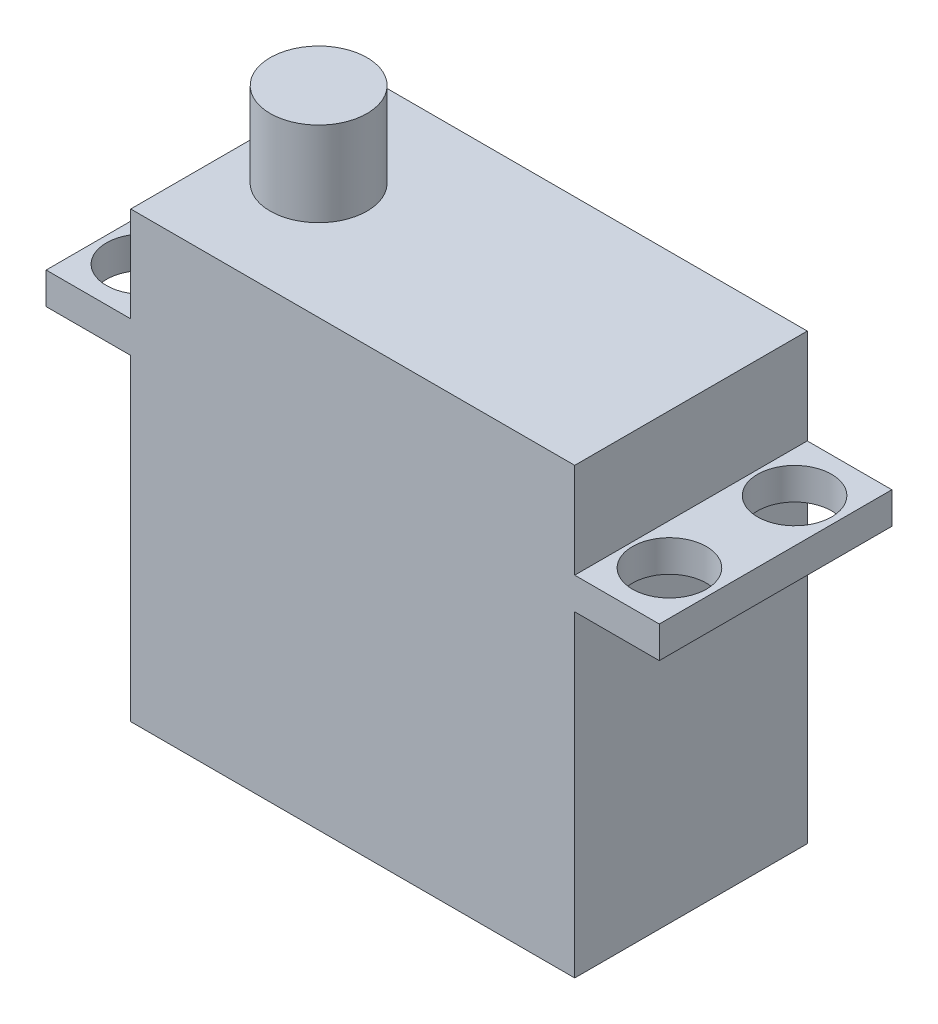
ISO-10303-21;
HEADER;
FILE_DESCRIPTION(('STEP AP214'),'2;1');
FILE_NAME('part.step','',(''),(''),'','','');
FILE_SCHEMA(('AUTOMOTIVE_DESIGN { 1 0 10303 214 1 1 1 1 }'));
ENDSEC;
DATA;
#1=APPLICATION_CONTEXT('core data for automotive mechanical design processes');
#2=APPLICATION_PROTOCOL_DEFINITION('international standard','automotive_design',2000,#1);
#3=PRODUCT_CONTEXT('',#1,'mechanical');
#4=PRODUCT('Part','Part','',(#3));
#5=PRODUCT_RELATED_PRODUCT_CATEGORY('part','',(#4));
#6=PRODUCT_DEFINITION_FORMATION('','',#4);
#7=PRODUCT_DEFINITION_CONTEXT('part definition',#1,'design');
#8=PRODUCT_DEFINITION('design','',#6,#7);
#9=PRODUCT_DEFINITION_SHAPE('','',#8);
#10=(LENGTH_UNIT() NAMED_UNIT(*) SI_UNIT(.MILLI.,.METRE.));
#11=(NAMED_UNIT(*) PLANE_ANGLE_UNIT() SI_UNIT($,.RADIAN.));
#12=(NAMED_UNIT(*) SI_UNIT($,.STERADIAN.) SOLID_ANGLE_UNIT());
#13=UNCERTAINTY_MEASURE_WITH_UNIT(LENGTH_MEASURE(1.E-05),#10,'distance_accuracy_value','');
#14=(GEOMETRIC_REPRESENTATION_CONTEXT(3) GLOBAL_UNCERTAINTY_ASSIGNED_CONTEXT((#13)) GLOBAL_UNIT_ASSIGNED_CONTEXT((#10,
#11,#12)) REPRESENTATION_CONTEXT('',''));
#15=CARTESIAN_POINT('',(0.,0.,0.));
#16=DIRECTION('',(0.,0.,1.));
#17=DIRECTION('',(1.,0.,0.));
#18=AXIS2_PLACEMENT_3D('',#15,#16,#17);
#19=CARTESIAN_POINT('',(0.,33.,0.));
#20=DIRECTION('',(0.,1.,0.));
#21=DIRECTION('',(0.,0.,1.));
#22=AXIS2_PLACEMENT_3D('',#19,#20,#21);
#23=PLANE('',#22);
#24=DIRECTION('',(0.,0.,-1.));
#25=VECTOR('',#24,1.);
#26=CARTESIAN_POINT('',(29.,33.,11.));
#27=LINE('',#26,#25);
#28=CARTESIAN_POINT('',(29.,33.,11.));
#29=VERTEX_POINT('',#28);
#30=CARTESIAN_POINT('',(29.,33.,-11.));
#31=VERTEX_POINT('',#30);
#32=EDGE_CURVE('E135',#29,#31,#27,.T.);
#33=ORIENTED_EDGE('',*,*,#32,.T.);
#34=DIRECTION('',(-1.,0.,0.));
#35=VECTOR('',#34,1.);
#36=CARTESIAN_POINT('',(29.,33.,-11.));
#37=LINE('',#36,#35);
#38=CARTESIAN_POINT('',(21.,33.,-11.));
#39=VERTEX_POINT('',#38);
#40=EDGE_CURVE('E124',#31,#39,#37,.T.);
#41=ORIENTED_EDGE('',*,*,#40,.T.);
#42=DIRECTION('',(0.,0.,1.));
#43=VECTOR('',#42,1.);
#44=CARTESIAN_POINT('',(21.,33.,11.));
#45=LINE('',#44,#43);
#46=CARTESIAN_POINT('',(21.,33.,11.));
#47=VERTEX_POINT('',#46);
#48=EDGE_CURVE('E134',#39,#47,#45,.T.);
#49=ORIENTED_EDGE('',*,*,#48,.T.);
#50=DIRECTION('',(1.,0.,0.));
#51=VECTOR('',#50,1.);
#52=CARTESIAN_POINT('',(29.,33.,11.));
#53=LINE('',#52,#51);
#54=EDGE_CURVE('E140',#47,#29,#53,.T.);
#55=ORIENTED_EDGE('',*,*,#54,.T.);
#56=EDGE_LOOP('',(#33,#41,#49,#55));
#57=FACE_BOUND('',#56,.T.);
#58=CARTESIAN_POINT('',(24.8796591270504,33.,5.91920643353499));
#59=DIRECTION('',(0.,1.,0.));
#60=DIRECTION('',(0.,0.,1.));
#61=AXIS2_PLACEMENT_3D('',#58,#59,#60);
#62=CIRCLE('',#61,3.5);
#63=CARTESIAN_POINT('',(24.8796591270504,33.,9.41920643353499));
#64=VERTEX_POINT('',#63);
#65=EDGE_CURVE('E275',#64,#64,#62,.T.);
#66=ORIENTED_EDGE('',*,*,#65,.F.);
#67=EDGE_LOOP('',(#66));
#68=FACE_BOUND('',#67,.T.);
#69=CARTESIAN_POINT('',(24.8796591270504,33.,-5.91920643353499));
#70=DIRECTION('',(0.,1.,0.));
#71=DIRECTION('',(0.,0.,1.));
#72=AXIS2_PLACEMENT_3D('',#69,#70,#71);
#73=CIRCLE('',#72,3.5);
#74=CARTESIAN_POINT('',(24.8796591270504,33.,-2.41920643353499));
#75=VERTEX_POINT('',#74);
#76=EDGE_CURVE('E263',#75,#75,#73,.F.);
#77=ORIENTED_EDGE('',*,*,#76,.T.);
#78=EDGE_LOOP('',(#77));
#79=FACE_BOUND('',#78,.T.);
#80=ADVANCED_FACE('F37',(#57,#68,#79),#23,.T.);
#81=CARTESIAN_POINT('',(0.,30.,0.));
#82=DIRECTION('',(0.,1.,0.));
#83=DIRECTION('',(0.,0.,1.));
#84=AXIS2_PLACEMENT_3D('',#81,#82,#83);
#85=PLANE('',#84);
#86=CARTESIAN_POINT('',(24.8796591270504,30.,5.91920643353499));
#87=DIRECTION('',(0.,1.,0.));
#88=DIRECTION('',(0.,0.,1.));
#89=AXIS2_PLACEMENT_3D('',#86,#87,#88);
#90=CIRCLE('',#89,3.5);
#91=CARTESIAN_POINT('',(24.8796591270504,30.,9.41920643353499));
#92=VERTEX_POINT('',#91);
#93=EDGE_CURVE('E269',#92,#92,#90,.T.);
#94=ORIENTED_EDGE('',*,*,#93,.T.);
#95=EDGE_LOOP('',(#94));
#96=FACE_BOUND('',#95,.T.);
#97=DIRECTION('',(0.,0.,-1.));
#98=VECTOR('',#97,1.);
#99=CARTESIAN_POINT('',(29.,30.,11.));
#100=LINE('',#99,#98);
#101=CARTESIAN_POINT('',(29.,30.,11.));
#102=VERTEX_POINT('',#101);
#103=CARTESIAN_POINT('',(29.,30.,-11.));
#104=VERTEX_POINT('',#103);
#105=EDGE_CURVE('E148',#102,#104,#100,.T.);
#106=ORIENTED_EDGE('',*,*,#105,.F.);
#107=DIRECTION('',(1.,0.,0.));
#108=VECTOR('',#107,1.);
#109=CARTESIAN_POINT('',(29.,30.,11.));
#110=LINE('',#109,#108);
#111=CARTESIAN_POINT('',(21.,30.,11.));
#112=VERTEX_POINT('',#111);
#113=EDGE_CURVE('E144',#112,#102,#110,.T.);
#114=ORIENTED_EDGE('',*,*,#113,.F.);
#115=DIRECTION('',(0.,0.,1.));
#116=VECTOR('',#115,1.);
#117=CARTESIAN_POINT('',(21.,30.,11.));
#118=LINE('',#117,#116);
#119=CARTESIAN_POINT('',(21.,30.,-11.));
#120=VERTEX_POINT('',#119);
#121=EDGE_CURVE('E52',#120,#112,#118,.T.);
#122=ORIENTED_EDGE('',*,*,#121,.F.);
#123=DIRECTION('',(-1.,0.,0.));
#124=VECTOR('',#123,1.);
#125=CARTESIAN_POINT('',(29.,30.,-11.));
#126=LINE('',#125,#124);
#127=EDGE_CURVE('E249',#104,#120,#126,.T.);
#128=ORIENTED_EDGE('',*,*,#127,.F.);
#129=EDGE_LOOP('',(#106,#114,#122,#128));
#130=FACE_BOUND('',#129,.T.);
#131=CARTESIAN_POINT('',(24.8796591270504,30.,-5.91920643353499));
#132=DIRECTION('',(0.,1.,0.));
#133=DIRECTION('',(0.,0.,1.));
#134=AXIS2_PLACEMENT_3D('',#131,#132,#133);
#135=CIRCLE('',#134,3.5);
#136=CARTESIAN_POINT('',(24.8796591270504,30.,-2.41920643353499));
#137=VERTEX_POINT('',#136);
#138=EDGE_CURVE('E260',#137,#137,#135,.F.);
#139=ORIENTED_EDGE('',*,*,#138,.F.);
#140=EDGE_LOOP('',(#139));
#141=FACE_BOUND('',#140,.T.);
#142=ADVANCED_FACE('F253',(#96,#130,#141),#85,.F.);
#143=CARTESIAN_POINT('',(21.,42.,-11.));
#144=DIRECTION('',(-1.,0.,0.));
#145=DIRECTION('',(0.,0.,1.));
#146=AXIS2_PLACEMENT_3D('',#143,#144,#145);
#147=PLANE('',#146);
#148=ORIENTED_EDGE('',*,*,#48,.F.);
#149=DIRECTION('',(0.,-1.,0.));
#150=VECTOR('',#149,1.);
#151=CARTESIAN_POINT('',(21.,42.,-11.));
#152=LINE('',#151,#150);
#153=CARTESIAN_POINT('',(21.,42.,-11.));
#154=VERTEX_POINT('',#153);
#155=EDGE_CURVE('E11',#154,#39,#152,.T.);
#156=ORIENTED_EDGE('',*,*,#155,.F.);
#157=DIRECTION('',(0.,0.,-1.));
#158=VECTOR('',#157,1.);
#159=CARTESIAN_POINT('',(21.,42.,-11.));
#160=LINE('',#159,#158);
#161=CARTESIAN_POINT('',(21.,42.,11.));
#162=VERTEX_POINT('',#161);
#163=EDGE_CURVE('E180',#162,#154,#160,.T.);
#164=ORIENTED_EDGE('',*,*,#163,.F.);
#165=DIRECTION('',(0.,-1.,0.));
#166=VECTOR('',#165,1.);
#167=CARTESIAN_POINT('',(21.,42.,11.));
#168=LINE('',#167,#166);
#169=EDGE_CURVE('E199',#162,#47,#168,.T.);
#170=ORIENTED_EDGE('',*,*,#169,.T.);
#171=EDGE_LOOP('',(#148,#156,#164,#170));
#172=FACE_BOUND('',#171,.T.);
#173=ADVANCED_FACE('F244',(#172),#147,.F.);
#174=CARTESIAN_POINT('',(-21.,42.,-11.));
#175=DIRECTION('',(1.,0.,0.));
#176=DIRECTION('',(0.,0.,-1.));
#177=AXIS2_PLACEMENT_3D('',#174,#175,#176);
#178=PLANE('',#177);
#179=DIRECTION('',(0.,0.,-1.));
#180=VECTOR('',#179,1.);
#181=CARTESIAN_POINT('',(-21.,33.,11.));
#182=LINE('',#181,#180);
#183=CARTESIAN_POINT('',(-21.,33.,11.));
#184=VERTEX_POINT('',#183);
#185=CARTESIAN_POINT('',(-21.,33.,-11.));
#186=VERTEX_POINT('',#185);
#187=EDGE_CURVE('E157',#184,#186,#182,.T.);
#188=ORIENTED_EDGE('',*,*,#187,.F.);
#189=DIRECTION('',(0.,-1.,0.));
#190=VECTOR('',#189,1.);
#191=CARTESIAN_POINT('',(-21.,42.,11.));
#192=LINE('',#191,#190);
#193=CARTESIAN_POINT('',(-21.,42.,11.));
#194=VERTEX_POINT('',#193);
#195=EDGE_CURVE('E202',#194,#184,#192,.T.);
#196=ORIENTED_EDGE('',*,*,#195,.F.);
#197=DIRECTION('',(0.,0.,1.));
#198=VECTOR('',#197,1.);
#199=CARTESIAN_POINT('',(-21.,42.,-11.));
#200=LINE('',#199,#198);
#201=CARTESIAN_POINT('',(-21.,42.,-11.));
#202=VERTEX_POINT('',#201);
#203=EDGE_CURVE('E186',#202,#194,#200,.T.);
#204=ORIENTED_EDGE('',*,*,#203,.F.);
#205=DIRECTION('',(0.,-1.,0.));
#206=VECTOR('',#205,1.);
#207=CARTESIAN_POINT('',(-21.,42.,-11.));
#208=LINE('',#207,#206);
#209=EDGE_CURVE('E205',#202,#186,#208,.T.);
#210=ORIENTED_EDGE('',*,*,#209,.T.);
#211=EDGE_LOOP('',(#188,#196,#204,#210));
#212=FACE_BOUND('',#211,.T.);
#213=ADVANCED_FACE('F237',(#212),#178,.F.);
#214=CARTESIAN_POINT('',(21.,0.,-11.));
#215=VERTEX_POINT('',#214);
#216=EDGE_CURVE('E45',#120,#215,#152,.T.);
#217=ORIENTED_EDGE('',*,*,#216,.F.);
#218=ORIENTED_EDGE('',*,*,#121,.T.);
#219=CARTESIAN_POINT('',(21.,0.,11.));
#220=VERTEX_POINT('',#219);
#221=EDGE_CURVE('E190',#112,#220,#168,.T.);
#222=ORIENTED_EDGE('',*,*,#221,.T.);
#223=DIRECTION('',(0.,0.,-1.));
#224=VECTOR('',#223,1.);
#225=CARTESIAN_POINT('',(21.,0.,-11.));
#226=LINE('',#225,#224);
#227=EDGE_CURVE('E179',#220,#215,#226,.T.);
#228=ORIENTED_EDGE('',*,*,#227,.T.);
#229=EDGE_LOOP('',(#217,#218,#222,#228));
#230=FACE_BOUND('',#229,.T.);
#231=ADVANCED_FACE('F39',(#230),#147,.F.);
#232=CARTESIAN_POINT('',(-21.,42.,-11.));
#233=DIRECTION('',(0.,0.,1.));
#234=DIRECTION('',(1.,0.,0.));
#235=AXIS2_PLACEMENT_3D('',#232,#233,#234);
#236=PLANE('',#235);
#237=DIRECTION('',(-1.,0.,0.));
#238=VECTOR('',#237,1.);
#239=CARTESIAN_POINT('',(-21.,0.,-11.));
#240=LINE('',#239,#238);
#241=CARTESIAN_POINT('',(-21.,0.,-11.));
#242=VERTEX_POINT('',#241);
#243=EDGE_CURVE('E192',#215,#242,#240,.T.);
#244=ORIENTED_EDGE('',*,*,#243,.T.);
#245=CARTESIAN_POINT('',(-21.,30.,-11.));
#246=VERTEX_POINT('',#245);
#247=EDGE_CURVE('E204',#246,#242,#208,.T.);
#248=ORIENTED_EDGE('',*,*,#247,.F.);
#249=DIRECTION('',(-1.,0.,0.));
#250=VECTOR('',#249,1.);
#251=CARTESIAN_POINT('',(-29.,30.,-11.));
#252=LINE('',#251,#250);
#253=CARTESIAN_POINT('',(-29.,30.,-11.));
#254=VERTEX_POINT('',#253);
#255=EDGE_CURVE('E152',#246,#254,#252,.T.);
#256=ORIENTED_EDGE('',*,*,#255,.T.);
#257=DIRECTION('',(0.,-1.,0.));
#258=VECTOR('',#257,1.);
#259=CARTESIAN_POINT('',(-29.,33.,-11.));
#260=LINE('',#259,#258);
#261=CARTESIAN_POINT('',(-29.,33.,-11.));
#262=VERTEX_POINT('',#261);
#263=EDGE_CURVE('E176',#262,#254,#260,.T.);
#264=ORIENTED_EDGE('',*,*,#263,.F.);
#265=DIRECTION('',(-1.,0.,0.));
#266=VECTOR('',#265,1.);
#267=CARTESIAN_POINT('',(-29.,33.,-11.));
#268=LINE('',#267,#266);
#269=EDGE_CURVE('E160',#186,#262,#268,.T.);
#270=ORIENTED_EDGE('',*,*,#269,.F.);
#271=ORIENTED_EDGE('',*,*,#209,.F.);
#272=DIRECTION('',(-1.,0.,0.));
#273=VECTOR('',#272,1.);
#274=CARTESIAN_POINT('',(-21.,42.,-11.));
#275=LINE('',#274,#273);
#276=EDGE_CURVE('E183',#154,#202,#275,.T.);
#277=ORIENTED_EDGE('',*,*,#276,.F.);
#278=ORIENTED_EDGE('',*,*,#155,.T.);
#279=ORIENTED_EDGE('',*,*,#40,.F.);
#280=DIRECTION('',(0.,-1.,0.));
#281=VECTOR('',#280,1.);
#282=CARTESIAN_POINT('',(29.,33.,-11.));
#283=LINE('',#282,#281);
#284=EDGE_CURVE('E129',#31,#104,#283,.T.);
#285=ORIENTED_EDGE('',*,*,#284,.T.);
#286=ORIENTED_EDGE('',*,*,#127,.T.);
#287=ORIENTED_EDGE('',*,*,#216,.T.);
#288=EDGE_LOOP('',(#244,#248,#256,#264,#270,#271,#277,#278,#279,#285,#286,#287));
#289=FACE_BOUND('',#288,.T.);
#290=ADVANCED_FACE('F127',(#289),#236,.F.);
#291=CARTESIAN_POINT('',(-21.,30.,11.));
#292=VERTEX_POINT('',#291);
#293=CARTESIAN_POINT('',(-21.,0.,11.));
#294=VERTEX_POINT('',#293);
#295=EDGE_CURVE('E201',#292,#294,#192,.T.);
#296=ORIENTED_EDGE('',*,*,#295,.F.);
#297=DIRECTION('',(0.,0.,-1.));
#298=VECTOR('',#297,1.);
#299=CARTESIAN_POINT('',(-21.,30.,11.));
#300=LINE('',#299,#298);
#301=EDGE_CURVE('E149',#292,#246,#300,.T.);
#302=ORIENTED_EDGE('',*,*,#301,.T.);
#303=ORIENTED_EDGE('',*,*,#247,.T.);
#304=DIRECTION('',(0.,0.,1.));
#305=VECTOR('',#304,1.);
#306=CARTESIAN_POINT('',(-21.,0.,-11.));
#307=LINE('',#306,#305);
#308=EDGE_CURVE('E194',#242,#294,#307,.T.);
#309=ORIENTED_EDGE('',*,*,#308,.T.);
#310=EDGE_LOOP('',(#296,#302,#303,#309));
#311=FACE_BOUND('',#310,.T.);
#312=ADVANCED_FACE('F212',(#311),#178,.F.);
#313=CARTESIAN_POINT('',(-21.,42.,11.));
#314=DIRECTION('',(0.,0.,-1.));
#315=DIRECTION('',(-1.,0.,0.));
#316=AXIS2_PLACEMENT_3D('',#313,#314,#315);
#317=PLANE('',#316);
#318=DIRECTION('',(1.,0.,0.));
#319=VECTOR('',#318,1.);
#320=CARTESIAN_POINT('',(-21.,0.,11.));
#321=LINE('',#320,#319);
#322=EDGE_CURVE('E184',#294,#220,#321,.T.);
#323=ORIENTED_EDGE('',*,*,#322,.T.);
#324=ORIENTED_EDGE('',*,*,#221,.F.);
#325=ORIENTED_EDGE('',*,*,#113,.T.);
#326=DIRECTION('',(0.,-1.,0.));
#327=VECTOR('',#326,1.);
#328=CARTESIAN_POINT('',(29.,33.,11.));
#329=LINE('',#328,#327);
#330=EDGE_CURVE('E150',#29,#102,#329,.T.);
#331=ORIENTED_EDGE('',*,*,#330,.F.);
#332=ORIENTED_EDGE('',*,*,#54,.F.);
#333=ORIENTED_EDGE('',*,*,#169,.F.);
#334=DIRECTION('',(1.,0.,0.));
#335=VECTOR('',#334,1.);
#336=CARTESIAN_POINT('',(-21.,42.,11.));
#337=LINE('',#336,#335);
#338=EDGE_CURVE('E188',#194,#162,#337,.T.);
#339=ORIENTED_EDGE('',*,*,#338,.F.);
#340=ORIENTED_EDGE('',*,*,#195,.T.);
#341=DIRECTION('',(1.,0.,0.));
#342=VECTOR('',#341,1.);
#343=CARTESIAN_POINT('',(-29.,33.,11.));
#344=LINE('',#343,#342);
#345=CARTESIAN_POINT('',(-29.,33.,11.));
#346=VERTEX_POINT('',#345);
#347=EDGE_CURVE('E165',#346,#184,#344,.T.);
#348=ORIENTED_EDGE('',*,*,#347,.F.);
#349=DIRECTION('',(0.,-1.,0.));
#350=VECTOR('',#349,1.);
#351=CARTESIAN_POINT('',(-29.,33.,11.));
#352=LINE('',#351,#350);
#353=CARTESIAN_POINT('',(-29.,30.,11.));
#354=VERTEX_POINT('',#353);
#355=EDGE_CURVE('E167',#346,#354,#352,.T.);
#356=ORIENTED_EDGE('',*,*,#355,.T.);
#357=DIRECTION('',(1.,0.,0.));
#358=VECTOR('',#357,1.);
#359=CARTESIAN_POINT('',(-29.,30.,11.));
#360=LINE('',#359,#358);
#361=EDGE_CURVE('E161',#354,#292,#360,.T.);
#362=ORIENTED_EDGE('',*,*,#361,.T.);
#363=ORIENTED_EDGE('',*,*,#295,.T.);
#364=EDGE_LOOP('',(#323,#324,#325,#331,#332,#333,#339,#340,#348,#356,#362,#363));
#365=FACE_BOUND('',#364,.T.);
#366=ADVANCED_FACE('F222',(#365),#317,.F.);
#367=CARTESIAN_POINT('',(0.,42.,0.));
#368=DIRECTION('',(0.,1.,0.));
#369=DIRECTION('',(0.,0.,1.));
#370=AXIS2_PLACEMENT_3D('',#367,#368,#369);
#371=PLANE('',#370);
#372=CARTESIAN_POINT('',(-14.2239565667632,42.,0.));
#373=DIRECTION('',(0.,1.,0.));
#374=DIRECTION('',(0.,0.,1.));
#375=AXIS2_PLACEMENT_3D('',#372,#373,#374);
#376=CIRCLE('',#375,4.58167322655841);
#377=CARTESIAN_POINT('',(-14.2239565667632,42.,4.58167322655841));
#378=VERTEX_POINT('',#377);
#379=EDGE_CURVE('E289',#378,#378,#376,.T.);
#380=ORIENTED_EDGE('',*,*,#379,.F.);
#381=EDGE_LOOP('',(#380));
#382=FACE_BOUND('',#381,.T.);
#383=ORIENTED_EDGE('',*,*,#163,.T.);
#384=ORIENTED_EDGE('',*,*,#276,.T.);
#385=ORIENTED_EDGE('',*,*,#203,.T.);
#386=ORIENTED_EDGE('',*,*,#338,.T.);
#387=EDGE_LOOP('',(#383,#384,#385,#386));
#388=FACE_BOUND('',#387,.T.);
#389=ADVANCED_FACE('F240',(#382,#388),#371,.T.);
#390=CARTESIAN_POINT('',(0.,0.,0.));
#391=DIRECTION('',(0.,1.,0.));
#392=DIRECTION('',(0.,0.,1.));
#393=AXIS2_PLACEMENT_3D('',#390,#391,#392);
#394=PLANE('',#393);
#395=ORIENTED_EDGE('',*,*,#227,.F.);
#396=ORIENTED_EDGE('',*,*,#322,.F.);
#397=ORIENTED_EDGE('',*,*,#308,.F.);
#398=ORIENTED_EDGE('',*,*,#243,.F.);
#399=EDGE_LOOP('',(#395,#396,#397,#398));
#400=FACE_BOUND('',#399,.T.);
#401=ADVANCED_FACE('F220',(#400),#394,.F.);
#402=CARTESIAN_POINT('',(-29.,33.,11.));
#403=DIRECTION('',(1.,0.,0.));
#404=DIRECTION('',(0.,0.,-1.));
#405=AXIS2_PLACEMENT_3D('',#402,#403,#404);
#406=PLANE('',#405);
#407=DIRECTION('',(0.,0.,1.));
#408=VECTOR('',#407,1.);
#409=CARTESIAN_POINT('',(-29.,30.,11.));
#410=LINE('',#409,#408);
#411=EDGE_CURVE('E170',#254,#354,#410,.T.);
#412=ORIENTED_EDGE('',*,*,#411,.T.);
#413=ORIENTED_EDGE('',*,*,#355,.F.);
#414=DIRECTION('',(0.,0.,1.));
#415=VECTOR('',#414,1.);
#416=CARTESIAN_POINT('',(-29.,33.,11.));
#417=LINE('',#416,#415);
#418=EDGE_CURVE('E163',#262,#346,#417,.T.);
#419=ORIENTED_EDGE('',*,*,#418,.F.);
#420=ORIENTED_EDGE('',*,*,#263,.T.);
#421=EDGE_LOOP('',(#412,#413,#419,#420));
#422=FACE_BOUND('',#421,.T.);
#423=ADVANCED_FACE('F233',(#422),#406,.F.);
#424=CARTESIAN_POINT('',(0.,33.,0.));
#425=DIRECTION('',(0.,-1.,0.));
#426=DIRECTION('',(0.,0.,-1.));
#427=AXIS2_PLACEMENT_3D('',#424,#425,#426);
#428=PLANE('',#427);
#429=CARTESIAN_POINT('',(-24.8796591270504,33.,-5.91920643353499));
#430=DIRECTION('',(0.,1.,0.));
#431=DIRECTION('',(0.,0.,1.));
#432=AXIS2_PLACEMENT_3D('',#429,#430,#431);
#433=CIRCLE('',#432,3.5);
#434=CARTESIAN_POINT('',(-24.8796591270504,33.,-2.41920643353499));
#435=VERTEX_POINT('',#434);
#436=EDGE_CURVE('E262',#435,#435,#433,.T.);
#437=ORIENTED_EDGE('',*,*,#436,.F.);
#438=EDGE_LOOP('',(#437));
#439=FACE_BOUND('',#438,.T.);
#440=CARTESIAN_POINT('',(-24.8796591270504,33.,5.91920643353499));
#441=DIRECTION('',(0.,1.,0.));
#442=DIRECTION('',(0.,0.,1.));
#443=AXIS2_PLACEMENT_3D('',#440,#441,#442);
#444=CIRCLE('',#443,3.5);
#445=CARTESIAN_POINT('',(-24.8796591270504,33.,9.41920643353499));
#446=VERTEX_POINT('',#445);
#447=EDGE_CURVE('E281',#446,#446,#444,.F.);
#448=ORIENTED_EDGE('',*,*,#447,.T.);
#449=EDGE_LOOP('',(#448));
#450=FACE_BOUND('',#449,.T.);
#451=ORIENTED_EDGE('',*,*,#187,.T.);
#452=ORIENTED_EDGE('',*,*,#269,.T.);
#453=ORIENTED_EDGE('',*,*,#418,.T.);
#454=ORIENTED_EDGE('',*,*,#347,.T.);
#455=EDGE_LOOP('',(#451,#452,#453,#454));
#456=FACE_BOUND('',#455,.T.);
#457=ADVANCED_FACE('F235',(#439,#450,#456),#428,.F.);
#458=CARTESIAN_POINT('',(0.,30.,0.));
#459=DIRECTION('',(0.,-1.,0.));
#460=DIRECTION('',(0.,0.,-1.));
#461=AXIS2_PLACEMENT_3D('',#458,#459,#460);
#462=PLANE('',#461);
#463=CARTESIAN_POINT('',(-24.8796591270504,30.,-5.91920643353499));
#464=DIRECTION('',(0.,1.,0.));
#465=DIRECTION('',(0.,0.,1.));
#466=AXIS2_PLACEMENT_3D('',#463,#464,#465);
#467=CIRCLE('',#466,3.5);
#468=CARTESIAN_POINT('',(-24.8796591270504,30.,-2.41920643353499));
#469=VERTEX_POINT('',#468);
#470=EDGE_CURVE('E266',#469,#469,#467,.T.);
#471=ORIENTED_EDGE('',*,*,#470,.T.);
#472=EDGE_LOOP('',(#471));
#473=FACE_BOUND('',#472,.T.);
#474=CARTESIAN_POINT('',(-24.8796591270504,30.,5.91920643353499));
#475=DIRECTION('',(0.,1.,0.));
#476=DIRECTION('',(0.,0.,1.));
#477=AXIS2_PLACEMENT_3D('',#474,#475,#476);
#478=CIRCLE('',#477,3.5);
#479=CARTESIAN_POINT('',(-24.8796591270504,30.,9.41920643353499));
#480=VERTEX_POINT('',#479);
#481=EDGE_CURVE('E250',#480,#480,#478,.F.);
#482=ORIENTED_EDGE('',*,*,#481,.F.);
#483=EDGE_LOOP('',(#482));
#484=FACE_BOUND('',#483,.T.);
#485=ORIENTED_EDGE('',*,*,#301,.F.);
#486=ORIENTED_EDGE('',*,*,#361,.F.);
#487=ORIENTED_EDGE('',*,*,#411,.F.);
#488=ORIENTED_EDGE('',*,*,#255,.F.);
#489=EDGE_LOOP('',(#485,#486,#487,#488));
#490=FACE_BOUND('',#489,.T.);
#491=ADVANCED_FACE('F229',(#473,#484,#490),#462,.T.);
#492=CARTESIAN_POINT('',(29.,33.,11.));
#493=DIRECTION('',(-1.,0.,0.));
#494=DIRECTION('',(0.,0.,1.));
#495=AXIS2_PLACEMENT_3D('',#492,#493,#494);
#496=PLANE('',#495);
#497=ORIENTED_EDGE('',*,*,#105,.T.);
#498=ORIENTED_EDGE('',*,*,#284,.F.);
#499=ORIENTED_EDGE('',*,*,#32,.F.);
#500=ORIENTED_EDGE('',*,*,#330,.T.);
#501=EDGE_LOOP('',(#497,#498,#499,#500));
#502=FACE_BOUND('',#501,.T.);
#503=ADVANCED_FACE('F146',(#502),#496,.F.);
#504=CARTESIAN_POINT('',(-24.8796591270504,30.,5.91920643353499));
#505=DIRECTION('',(0.,1.,0.));
#506=DIRECTION('',(0.,0.,1.));
#507=AXIS2_PLACEMENT_3D('',#504,#505,#506);
#508=CYLINDRICAL_SURFACE('',#507,3.5);
#509=ORIENTED_EDGE('',*,*,#481,.T.);
#510=EDGE_LOOP('',(#509));
#511=FACE_BOUND('',#510,.T.);
#512=ORIENTED_EDGE('',*,*,#447,.F.);
#513=EDGE_LOOP('',(#512));
#514=FACE_BOUND('',#513,.T.);
#515=ADVANCED_FACE('F318',(#511,#514),#508,.F.);
#516=CARTESIAN_POINT('',(24.8796591270504,30.,5.91920643353499));
#517=DIRECTION('',(0.,1.,0.));
#518=DIRECTION('',(0.,0.,1.));
#519=AXIS2_PLACEMENT_3D('',#516,#517,#518);
#520=CYLINDRICAL_SURFACE('',#519,3.5);
#521=ORIENTED_EDGE('',*,*,#93,.F.);
#522=EDGE_LOOP('',(#521));
#523=FACE_BOUND('',#522,.T.);
#524=ORIENTED_EDGE('',*,*,#65,.T.);
#525=EDGE_LOOP('',(#524));
#526=FACE_BOUND('',#525,.T.);
#527=ADVANCED_FACE('F352',(#523,#526),#520,.F.);
#528=CARTESIAN_POINT('',(24.8796591270504,30.,-5.91920643353499));
#529=DIRECTION('',(0.,1.,0.));
#530=DIRECTION('',(0.,0.,1.));
#531=AXIS2_PLACEMENT_3D('',#528,#529,#530);
#532=CYLINDRICAL_SURFACE('',#531,3.5);
#533=ORIENTED_EDGE('',*,*,#138,.T.);
#534=EDGE_LOOP('',(#533));
#535=FACE_BOUND('',#534,.T.);
#536=ORIENTED_EDGE('',*,*,#76,.F.);
#537=EDGE_LOOP('',(#536));
#538=FACE_BOUND('',#537,.T.);
#539=ADVANCED_FACE('F359',(#535,#538),#532,.F.);
#540=CARTESIAN_POINT('',(-24.8796591270504,30.,-5.91920643353499));
#541=DIRECTION('',(0.,1.,0.));
#542=DIRECTION('',(0.,0.,1.));
#543=AXIS2_PLACEMENT_3D('',#540,#541,#542);
#544=CYLINDRICAL_SURFACE('',#543,3.5);
#545=ORIENTED_EDGE('',*,*,#470,.F.);
#546=EDGE_LOOP('',(#545));
#547=FACE_BOUND('',#546,.T.);
#548=ORIENTED_EDGE('',*,*,#436,.T.);
#549=EDGE_LOOP('',(#548));
#550=FACE_BOUND('',#549,.T.);
#551=ADVANCED_FACE('F300',(#547,#550),#544,.F.);
#552=CARTESIAN_POINT('',(-14.2239565667632,50.,0.));
#553=DIRECTION('',(0.,-1.,0.));
#554=DIRECTION('',(0.,0.,-1.));
#555=AXIS2_PLACEMENT_3D('',#552,#553,#554);
#556=CYLINDRICAL_SURFACE('',#555,4.58167322655841);
#557=CARTESIAN_POINT('',(-14.2239565667632,50.,0.));
#558=DIRECTION('',(0.,1.,0.));
#559=DIRECTION('',(0.,0.,1.));
#560=AXIS2_PLACEMENT_3D('',#557,#558,#559);
#561=CIRCLE('',#560,4.58167322655841);
#562=CARTESIAN_POINT('',(-14.2239565667632,50.,4.58167322655841));
#563=VERTEX_POINT('',#562);
#564=EDGE_CURVE('E278',#563,#563,#561,.T.);
#565=ORIENTED_EDGE('',*,*,#564,.F.);
#566=EDGE_LOOP('',(#565));
#567=FACE_BOUND('',#566,.T.);
#568=ORIENTED_EDGE('',*,*,#379,.T.);
#569=EDGE_LOOP('',(#568));
#570=FACE_BOUND('',#569,.T.);
#571=ADVANCED_FACE('F297',(#567,#570),#556,.T.);
#572=CARTESIAN_POINT('',(-14.2239565667632,50.,0.));
#573=DIRECTION('',(0.,1.,0.));
#574=DIRECTION('',(0.,0.,1.));
#575=AXIS2_PLACEMENT_3D('',#572,#573,#574);
#576=PLANE('',#575);
#577=ORIENTED_EDGE('',*,*,#564,.T.);
#578=EDGE_LOOP('',(#577));
#579=FACE_BOUND('',#578,.T.);
#580=ADVANCED_FACE('F295',(#579),#576,.T.);
#581=CLOSED_SHELL('',(#80,#142,#173,#213,#231,#290,#312,#366,#389,#401,#423,#457,#491,#503,#515,
#527,#539,#551,#571,#580));
#582=MANIFOLD_SOLID_BREP('B2',#581);
#583=ADVANCED_BREP_SHAPE_REPRESENTATION('',(#18,#582),#14);
#584=SHAPE_DEFINITION_REPRESENTATION(#9,#583);
ENDSEC;
END-ISO-10303-21;
